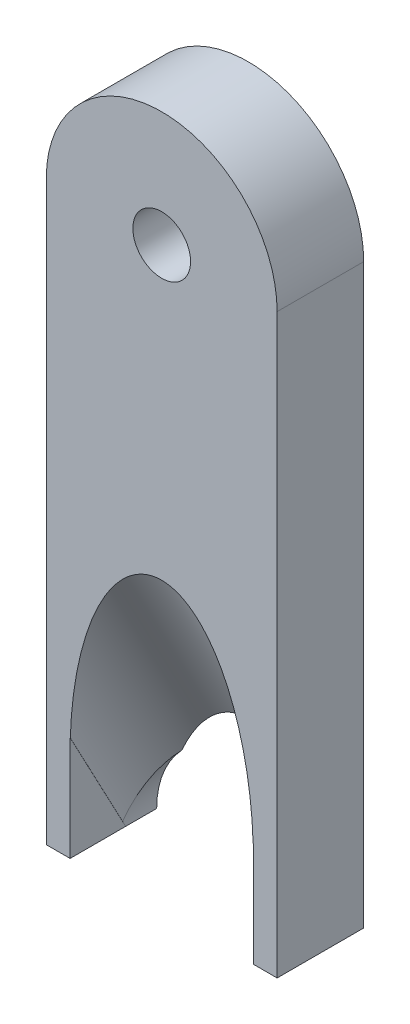
ISO-10303-21;
HEADER;
FILE_DESCRIPTION(('STEP AP214'),'2;1');
FILE_NAME('part.step','',(''),(''),'','','');
FILE_SCHEMA(('AUTOMOTIVE_DESIGN { 1 0 10303 214 1 1 1 1 }'));
ENDSEC;
DATA;
#1=APPLICATION_CONTEXT('core data for automotive mechanical design processes');
#2=APPLICATION_PROTOCOL_DEFINITION('international standard','automotive_design',2000,#1);
#3=PRODUCT_CONTEXT('',#1,'mechanical');
#4=PRODUCT('Part','Part','',(#3));
#5=PRODUCT_RELATED_PRODUCT_CATEGORY('part','',(#4));
#6=PRODUCT_DEFINITION_FORMATION('','',#4);
#7=PRODUCT_DEFINITION_CONTEXT('part definition',#1,'design');
#8=PRODUCT_DEFINITION('design','',#6,#7);
#9=PRODUCT_DEFINITION_SHAPE('','',#8);
#10=(LENGTH_UNIT() NAMED_UNIT(*) SI_UNIT(.MILLI.,.METRE.));
#11=(NAMED_UNIT(*) PLANE_ANGLE_UNIT() SI_UNIT($,.RADIAN.));
#12=(NAMED_UNIT(*) SI_UNIT($,.STERADIAN.) SOLID_ANGLE_UNIT());
#13=UNCERTAINTY_MEASURE_WITH_UNIT(LENGTH_MEASURE(1.E-05),#10,'distance_accuracy_value','');
#14=(GEOMETRIC_REPRESENTATION_CONTEXT(3) GLOBAL_UNCERTAINTY_ASSIGNED_CONTEXT((#13)) GLOBAL_UNIT_ASSIGNED_CONTEXT((#10,
#11,#12)) REPRESENTATION_CONTEXT('',''));
#15=CARTESIAN_POINT('',(0.,0.,0.));
#16=DIRECTION('',(0.,0.,1.));
#17=DIRECTION('',(1.,0.,0.));
#18=AXIS2_PLACEMENT_3D('',#15,#16,#17);
#19=CARTESIAN_POINT('',(0.,-100.,15.));
#20=DIRECTION('',(0.,0.,-1.));
#21=DIRECTION('',(-1.,0.,0.));
#22=AXIS2_PLACEMENT_3D('',#19,#20,#21);
#23=CYLINDRICAL_SURFACE('',#22,15.875);
#24=CARTESIAN_POINT('',(0.,-100.,5.37315456914315));
#25=DIRECTION('',(0.,-0.469471562785895,0.882947592858925));
#26=DIRECTION('',(0.,-0.882947592858925,-0.469471562785895));
#27=AXIS2_PLACEMENT_3D('',#24,#25,#26);
#28=ELLIPSE('',#27,17.9795495546885,15.875);
#29=CARTESIAN_POINT('',(15.8404269209739,-98.9528610592261,5.92992822021265));
#30=VERTEX_POINT('',#29);
#31=CARTESIAN_POINT('',(15.875,-100.,5.37315456914314));
#32=VERTEX_POINT('',#31);
#33=EDGE_CURVE('E211',#30,#32,#28,.F.);
#34=ORIENTED_EDGE('',*,*,#33,.F.);
#35=CARTESIAN_POINT('',(0.,-100.,6.55911277237393));
#36=DIRECTION('',(0.,-0.515038074910052,-0.857167300702113));
#37=DIRECTION('',(0.,0.857167300702113,-0.515038074910052));
#38=AXIS2_PLACEMENT_3D('',#35,#36,#37);
#39=ELLIPSE('',#38,18.5203051807933,15.875);
#40=CARTESIAN_POINT('',(11.5261560034812,-89.0838031905149,0.));
#41=VERTEX_POINT('',#40);
#42=EDGE_CURVE('E157',#41,#30,#39,.T.);
#43=ORIENTED_EDGE('',*,*,#42,.F.);
#44=CARTESIAN_POINT('',(0.,-100.,0.));
#45=DIRECTION('',(0.,0.,-1.));
#46=DIRECTION('',(-1.,0.,0.));
#47=AXIS2_PLACEMENT_3D('',#44,#45,#46);
#48=CIRCLE('',#47,15.875);
#49=CARTESIAN_POINT('',(15.875,-100.,0.));
#50=VERTEX_POINT('',#49);
#51=EDGE_CURVE('E188',#41,#50,#48,.T.);
#52=ORIENTED_EDGE('',*,*,#51,.T.);
#53=DIRECTION('',(0.,0.,-1.));
#54=VECTOR('',#53,1.);
#55=CARTESIAN_POINT('',(15.875,-100.,15.));
#56=LINE('',#55,#54);
#57=EDGE_CURVE('E198',#32,#50,#56,.T.);
#58=ORIENTED_EDGE('',*,*,#57,.F.);
#59=EDGE_LOOP('',(#34,#43,#52,#58));
#60=FACE_BOUND('',#59,.T.);
#61=ADVANCED_FACE('F33',(#60),#23,.F.);
#62=CARTESIAN_POINT('',(0.,-100.,5.37315456914315));
#63=DIRECTION('',(0.,-0.469471562785895,0.882947592858925));
#64=DIRECTION('',(0.,-0.882947592858925,-0.469471562785895));
#65=AXIS2_PLACEMENT_3D('',#62,#63,#64);
#66=ELLIPSE('',#65,17.9795495546885,15.875);
#67=CARTESIAN_POINT('',(-15.875,-100.,5.37315456914315));
#68=VERTEX_POINT('',#67);
#69=CARTESIAN_POINT('',(-15.8404269209739,-98.9528610592261,5.92992822021265));
#70=VERTEX_POINT('',#69);
#71=EDGE_CURVE('E48',#68,#70,#66,.F.);
#72=ORIENTED_EDGE('',*,*,#71,.F.);
#73=DIRECTION('',(0.,0.,-1.));
#74=VECTOR('',#73,1.);
#75=CARTESIAN_POINT('',(-15.875,-100.,15.));
#76=LINE('',#75,#74);
#77=CARTESIAN_POINT('',(-15.875,-100.,0.));
#78=VERTEX_POINT('',#77);
#79=EDGE_CURVE('E140',#68,#78,#76,.T.);
#80=ORIENTED_EDGE('',*,*,#79,.T.);
#81=CARTESIAN_POINT('',(-11.5261560034812,-89.0838031905148,0.));
#82=VERTEX_POINT('',#81);
#83=EDGE_CURVE('E189',#78,#82,#48,.T.);
#84=ORIENTED_EDGE('',*,*,#83,.T.);
#85=EDGE_CURVE('E165',#70,#82,#39,.T.);
#86=ORIENTED_EDGE('',*,*,#85,.F.);
#87=EDGE_LOOP('',(#72,#80,#84,#86));
#88=FACE_BOUND('',#87,.T.);
#89=ADVANCED_FACE('F236',(#88),#23,.F.);
#90=CARTESIAN_POINT('',(0.,0.,15.));
#91=DIRECTION('',(0.,0.,1.));
#92=DIRECTION('',(1.,0.,0.));
#93=AXIS2_PLACEMENT_3D('',#90,#91,#92);
#94=PLANE('',#93);
#95=CARTESIAN_POINT('',(0.,0.,15.));
#96=DIRECTION('',(0.,0.,1.));
#97=DIRECTION('',(1.,0.,0.));
#98=AXIS2_PLACEMENT_3D('',#95,#96,#97);
#99=CIRCLE('',#98,5.);
#100=CARTESIAN_POINT('',(5.,0.,15.));
#101=VERTEX_POINT('',#100);
#102=EDGE_CURVE('E168',#101,#101,#99,.T.);
#103=ORIENTED_EDGE('',*,*,#102,.F.);
#104=EDGE_LOOP('',(#103));
#105=FACE_BOUND('',#104,.T.);
#106=DIRECTION('',(0.,-1.,0.));
#107=VECTOR('',#106,1.);
#108=CARTESIAN_POINT('',(15.875,0.,15.));
#109=LINE('',#108,#107);
#110=CARTESIAN_POINT('',(15.875,-81.8945370203893,15.));
#111=VERTEX_POINT('',#110);
#112=CARTESIAN_POINT('',(15.875,-100.,15.));
#113=VERTEX_POINT('',#112);
#114=EDGE_CURVE('E216',#111,#113,#109,.T.);
#115=ORIENTED_EDGE('',*,*,#114,.T.);
#116=DIRECTION('',(1.,0.,0.));
#117=VECTOR('',#116,1.);
#118=CARTESIAN_POINT('',(20.,-100.,15.));
#119=LINE('',#118,#117);
#120=CARTESIAN_POINT('',(20.,-100.,15.));
#121=VERTEX_POINT('',#120);
#122=EDGE_CURVE('E135',#113,#121,#119,.T.);
#123=ORIENTED_EDGE('',*,*,#122,.T.);
#124=DIRECTION('',(0.,1.,0.));
#125=VECTOR('',#124,1.);
#126=CARTESIAN_POINT('',(20.,0.,15.));
#127=LINE('',#126,#125);
#128=CARTESIAN_POINT('',(20.,0.,15.));
#129=VERTEX_POINT('',#128);
#130=EDGE_CURVE('E179',#121,#129,#127,.T.);
#131=ORIENTED_EDGE('',*,*,#130,.T.);
#132=CARTESIAN_POINT('',(0.,0.,15.));
#133=DIRECTION('',(0.,0.,1.));
#134=DIRECTION('',(1.,0.,0.));
#135=AXIS2_PLACEMENT_3D('',#132,#133,#134);
#136=CIRCLE('',#135,20.);
#137=CARTESIAN_POINT('',(-20.,0.,15.));
#138=VERTEX_POINT('',#137);
#139=EDGE_CURVE('E174',#129,#138,#136,.T.);
#140=ORIENTED_EDGE('',*,*,#139,.T.);
#141=DIRECTION('',(0.,-1.,0.));
#142=VECTOR('',#141,1.);
#143=CARTESIAN_POINT('',(-20.,0.,15.));
#144=LINE('',#143,#142);
#145=CARTESIAN_POINT('',(-20.,-100.,15.));
#146=VERTEX_POINT('',#145);
#147=EDGE_CURVE('E131',#138,#146,#144,.T.);
#148=ORIENTED_EDGE('',*,*,#147,.T.);
#149=DIRECTION('',(1.,0.,0.));
#150=VECTOR('',#149,1.);
#151=CARTESIAN_POINT('',(-20.,-100.,15.));
#152=LINE('',#151,#150);
#153=CARTESIAN_POINT('',(-15.875,-100.,15.));
#154=VERTEX_POINT('',#153);
#155=EDGE_CURVE('E128',#146,#154,#152,.T.);
#156=ORIENTED_EDGE('',*,*,#155,.T.);
#157=DIRECTION('',(0.,1.,0.));
#158=VECTOR('',#157,1.);
#159=CARTESIAN_POINT('',(-15.875,0.,15.));
#160=LINE('',#159,#158);
#161=CARTESIAN_POINT('',(-15.875,-81.8945370203893,15.));
#162=VERTEX_POINT('',#161);
#163=EDGE_CURVE('E116',#154,#162,#160,.T.);
#164=ORIENTED_EDGE('',*,*,#163,.T.);
#165=DIRECTION('',(1.,0.,0.));
#166=VECTOR('',#165,1.);
#167=CARTESIAN_POINT('',(0.,-81.8945370203893,15.));
#168=LINE('',#167,#166);
#169=CARTESIAN_POINT('',(-15.8404269209739,-81.8945370203893,15.));
#170=VERTEX_POINT('',#169);
#171=EDGE_CURVE('E160',#162,#170,#168,.T.);
#172=ORIENTED_EDGE('',*,*,#171,.T.);
#173=CARTESIAN_POINT('',(0.,-84.125,15.));
#174=DIRECTION('',(0.,0.,1.));
#175=DIRECTION('',(0.,-1.,0.));
#176=AXIS2_PLACEMENT_3D('',#173,#174,#175);
#177=ELLIPSE('',#176,33.8146146825082,15.875);
#178=CARTESIAN_POINT('',(15.8404269209739,-81.8945370203893,15.));
#179=VERTEX_POINT('',#178);
#180=EDGE_CURVE('E155',#170,#179,#177,.F.);
#181=ORIENTED_EDGE('',*,*,#180,.T.);
#182=EDGE_CURVE('E55',#179,#111,#168,.T.);
#183=ORIENTED_EDGE('',*,*,#182,.T.);
#184=EDGE_LOOP('',(#115,#123,#131,#140,#148,#156,#164,#172,#181,#183));
#185=FACE_BOUND('',#184,.T.);
#186=ADVANCED_FACE('F129',(#105,#185),#94,.T.);
#187=CARTESIAN_POINT('',(0.,-46.2102295224906,35.1596410621721));
#188=DIRECTION('',(0.,-0.882947592858925,-0.469471562785895));
#189=DIRECTION('',(0.,0.469471562785895,-0.882947592858925));
#190=AXIS2_PLACEMENT_3D('',#187,#188,#189);
#191=CYLINDRICAL_SURFACE('',#190,15.875);
#192=ORIENTED_EDGE('',*,*,#180,.F.);
#193=DIRECTION('',(0.,-0.882947592858925,-0.469471562785895));
#194=VECTOR('',#193,1.);
#195=CARTESIAN_POINT('',(-15.8404269209739,-45.7186275675115,34.235072255027));
#196=LINE('',#195,#194);
#197=EDGE_CURVE('E11',#170,#70,#196,.T.);
#198=ORIENTED_EDGE('',*,*,#197,.T.);
#199=ORIENTED_EDGE('',*,*,#85,.T.);
#200=CARTESIAN_POINT('',(0.,-112.335896980195,0.));
#201=DIRECTION('',(0.,0.,1.));
#202=DIRECTION('',(0.,-1.,0.));
#203=AXIS2_PLACEMENT_3D('',#200,#201,#202);
#204=ELLIPSE('',#203,33.8146146825082,15.875);
#205=EDGE_CURVE('E161',#82,#41,#204,.F.);
#206=ORIENTED_EDGE('',*,*,#205,.T.);
#207=ORIENTED_EDGE('',*,*,#42,.T.);
#208=DIRECTION('',(0.,-0.882947592858925,-0.469471562785895));
#209=VECTOR('',#208,1.);
#210=CARTESIAN_POINT('',(15.8404269209739,-45.7186275675115,34.235072255027));
#211=LINE('',#210,#209);
#212=EDGE_CURVE('E41',#30,#179,#211,.F.);
#213=ORIENTED_EDGE('',*,*,#212,.T.);
#214=EDGE_LOOP('',(#192,#198,#199,#206,#207,#213));
#215=FACE_BOUND('',#214,.T.);
#216=ADVANCED_FACE('F154',(#215),#191,.F.);
#217=CARTESIAN_POINT('',(0.,0.,0.));
#218=DIRECTION('',(0.,0.,1.));
#219=DIRECTION('',(1.,0.,0.));
#220=AXIS2_PLACEMENT_3D('',#217,#218,#219);
#221=PLANE('',#220);
#222=ORIENTED_EDGE('',*,*,#205,.F.);
#223=ORIENTED_EDGE('',*,*,#83,.F.);
#224=DIRECTION('',(1.,0.,0.));
#225=VECTOR('',#224,1.);
#226=CARTESIAN_POINT('',(-20.,-100.,0.));
#227=LINE('',#226,#225);
#228=CARTESIAN_POINT('',(-20.,-100.,0.));
#229=VERTEX_POINT('',#228);
#230=EDGE_CURVE('E186',#229,#78,#227,.T.);
#231=ORIENTED_EDGE('',*,*,#230,.F.);
#232=DIRECTION('',(0.,-1.,0.));
#233=VECTOR('',#232,1.);
#234=CARTESIAN_POINT('',(-20.,0.,0.));
#235=LINE('',#234,#233);
#236=CARTESIAN_POINT('',(-20.,0.,0.));
#237=VERTEX_POINT('',#236);
#238=EDGE_CURVE('E184',#237,#229,#235,.T.);
#239=ORIENTED_EDGE('',*,*,#238,.F.);
#240=CARTESIAN_POINT('',(0.,0.,0.));
#241=DIRECTION('',(0.,0.,1.));
#242=DIRECTION('',(1.,0.,0.));
#243=AXIS2_PLACEMENT_3D('',#240,#241,#242);
#244=CIRCLE('',#243,20.);
#245=CARTESIAN_POINT('',(20.,0.,0.));
#246=VERTEX_POINT('',#245);
#247=EDGE_CURVE('E171',#246,#237,#244,.T.);
#248=ORIENTED_EDGE('',*,*,#247,.F.);
#249=DIRECTION('',(0.,1.,0.));
#250=VECTOR('',#249,1.);
#251=CARTESIAN_POINT('',(20.,0.,0.));
#252=LINE('',#251,#250);
#253=CARTESIAN_POINT('',(20.,-100.,0.));
#254=VERTEX_POINT('',#253);
#255=EDGE_CURVE('E176',#254,#246,#252,.T.);
#256=ORIENTED_EDGE('',*,*,#255,.F.);
#257=DIRECTION('',(1.,0.,0.));
#258=VECTOR('',#257,1.);
#259=CARTESIAN_POINT('',(20.,-100.,0.));
#260=LINE('',#259,#258);
#261=EDGE_CURVE('E192',#50,#254,#260,.T.);
#262=ORIENTED_EDGE('',*,*,#261,.F.);
#263=ORIENTED_EDGE('',*,*,#51,.F.);
#264=EDGE_LOOP('',(#222,#223,#231,#239,#248,#256,#262,#263));
#265=FACE_BOUND('',#264,.T.);
#266=CARTESIAN_POINT('',(0.,0.,0.));
#267=DIRECTION('',(0.,0.,1.));
#268=DIRECTION('',(1.,0.,0.));
#269=AXIS2_PLACEMENT_3D('',#266,#267,#268);
#270=CIRCLE('',#269,5.);
#271=CARTESIAN_POINT('',(5.,0.,0.));
#272=VERTEX_POINT('',#271);
#273=EDGE_CURVE('E163',#272,#272,#270,.T.);
#274=ORIENTED_EDGE('',*,*,#273,.T.);
#275=EDGE_LOOP('',(#274));
#276=FACE_BOUND('',#275,.T.);
#277=ADVANCED_FACE('F222',(#265,#276),#221,.F.);
#278=CARTESIAN_POINT('',(0.,0.,15.));
#279=DIRECTION('',(0.,0.,-1.));
#280=DIRECTION('',(-1.,0.,0.));
#281=AXIS2_PLACEMENT_3D('',#278,#279,#280);
#282=CYLINDRICAL_SURFACE('',#281,20.);
#283=ORIENTED_EDGE('',*,*,#247,.T.);
#284=DIRECTION('',(0.,0.,-1.));
#285=VECTOR('',#284,1.);
#286=CARTESIAN_POINT('',(-20.,0.,15.));
#287=LINE('',#286,#285);
#288=EDGE_CURVE('E143',#138,#237,#287,.T.);
#289=ORIENTED_EDGE('',*,*,#288,.F.);
#290=ORIENTED_EDGE('',*,*,#139,.F.);
#291=DIRECTION('',(0.,0.,-1.));
#292=VECTOR('',#291,1.);
#293=CARTESIAN_POINT('',(20.,0.,15.));
#294=LINE('',#293,#292);
#295=EDGE_CURVE('E181',#129,#246,#294,.T.);
#296=ORIENTED_EDGE('',*,*,#295,.T.);
#297=EDGE_LOOP('',(#283,#289,#290,#296));
#298=FACE_BOUND('',#297,.T.);
#299=ADVANCED_FACE('F35',(#298),#282,.T.);
#300=CARTESIAN_POINT('',(-20.,0.,15.));
#301=DIRECTION('',(1.,0.,0.));
#302=DIRECTION('',(0.,1.,0.));
#303=AXIS2_PLACEMENT_3D('',#300,#301,#302);
#304=PLANE('',#303);
#305=ORIENTED_EDGE('',*,*,#238,.T.);
#306=DIRECTION('',(0.,0.,-1.));
#307=VECTOR('',#306,1.);
#308=CARTESIAN_POINT('',(-20.,-100.,15.));
#309=LINE('',#308,#307);
#310=EDGE_CURVE('E141',#146,#229,#309,.T.);
#311=ORIENTED_EDGE('',*,*,#310,.F.);
#312=ORIENTED_EDGE('',*,*,#147,.F.);
#313=ORIENTED_EDGE('',*,*,#288,.T.);
#314=EDGE_LOOP('',(#305,#311,#312,#313));
#315=FACE_BOUND('',#314,.T.);
#316=ADVANCED_FACE('F240',(#315),#304,.F.);
#317=CARTESIAN_POINT('',(-20.,-100.,15.));
#318=DIRECTION('',(0.,1.,0.));
#319=DIRECTION('',(0.,0.,1.));
#320=AXIS2_PLACEMENT_3D('',#317,#318,#319);
#321=PLANE('',#320);
#322=ORIENTED_EDGE('',*,*,#230,.T.);
#323=ORIENTED_EDGE('',*,*,#79,.F.);
#324=EDGE_CURVE('E120',#154,#68,#76,.T.);
#325=ORIENTED_EDGE('',*,*,#324,.F.);
#326=ORIENTED_EDGE('',*,*,#155,.F.);
#327=ORIENTED_EDGE('',*,*,#310,.T.);
#328=EDGE_LOOP('',(#322,#323,#325,#326,#327));
#329=FACE_BOUND('',#328,.T.);
#330=ADVANCED_FACE('F139',(#329),#321,.F.);
#331=CARTESIAN_POINT('',(20.,-100.,15.));
#332=DIRECTION('',(0.,1.,0.));
#333=DIRECTION('',(0.,0.,1.));
#334=AXIS2_PLACEMENT_3D('',#331,#332,#333);
#335=PLANE('',#334);
#336=ORIENTED_EDGE('',*,*,#261,.T.);
#337=DIRECTION('',(0.,0.,-1.));
#338=VECTOR('',#337,1.);
#339=CARTESIAN_POINT('',(20.,-100.,15.));
#340=LINE('',#339,#338);
#341=EDGE_CURVE('E196',#121,#254,#340,.T.);
#342=ORIENTED_EDGE('',*,*,#341,.F.);
#343=ORIENTED_EDGE('',*,*,#122,.F.);
#344=EDGE_CURVE('E145',#113,#32,#56,.T.);
#345=ORIENTED_EDGE('',*,*,#344,.T.);
#346=ORIENTED_EDGE('',*,*,#57,.T.);
#347=EDGE_LOOP('',(#336,#342,#343,#345,#346));
#348=FACE_BOUND('',#347,.T.);
#349=ADVANCED_FACE('F208',(#348),#335,.F.);
#350=CARTESIAN_POINT('',(20.,0.,15.));
#351=DIRECTION('',(-1.,0.,0.));
#352=DIRECTION('',(0.,-1.,0.));
#353=AXIS2_PLACEMENT_3D('',#350,#351,#352);
#354=PLANE('',#353);
#355=ORIENTED_EDGE('',*,*,#255,.T.);
#356=ORIENTED_EDGE('',*,*,#295,.F.);
#357=ORIENTED_EDGE('',*,*,#130,.F.);
#358=ORIENTED_EDGE('',*,*,#341,.T.);
#359=EDGE_LOOP('',(#355,#356,#357,#358));
#360=FACE_BOUND('',#359,.T.);
#361=ADVANCED_FACE('F226',(#360),#354,.F.);
#362=CARTESIAN_POINT('',(0.,0.,15.));
#363=DIRECTION('',(0.,0.,-1.));
#364=DIRECTION('',(-1.,0.,0.));
#365=AXIS2_PLACEMENT_3D('',#362,#363,#364);
#366=CYLINDRICAL_SURFACE('',#365,5.);
#367=ORIENTED_EDGE('',*,*,#102,.T.);
#368=EDGE_LOOP('',(#367));
#369=FACE_BOUND('',#368,.T.);
#370=ORIENTED_EDGE('',*,*,#273,.F.);
#371=EDGE_LOOP('',(#370));
#372=FACE_BOUND('',#371,.T.);
#373=ADVANCED_FACE('F263',(#369,#372),#366,.F.);
#374=CARTESIAN_POINT('',(15.875,-48.3674703460883,32.8266575666693));
#375=DIRECTION('',(0.,-0.469471562785895,0.882947592858925));
#376=DIRECTION('',(0.,-0.882947592858925,-0.469471562785895));
#377=AXIS2_PLACEMENT_3D('',#374,#375,#376);
#378=PLANE('',#377);
#379=ORIENTED_EDGE('',*,*,#33,.T.);
#380=DIRECTION('',(0.,-0.882947592858925,-0.469471562785895));
#381=VECTOR('',#380,1.);
#382=CARTESIAN_POINT('',(15.875,-48.3674703460883,32.8266575666693));
#383=LINE('',#382,#381);
#384=EDGE_CURVE('E125',#111,#32,#383,.T.);
#385=ORIENTED_EDGE('',*,*,#384,.F.);
#386=ORIENTED_EDGE('',*,*,#182,.F.);
#387=ORIENTED_EDGE('',*,*,#212,.F.);
#388=EDGE_LOOP('',(#379,#385,#386,#387));
#389=FACE_BOUND('',#388,.T.);
#390=ADVANCED_FACE('F212',(#389),#378,.T.);
#391=CARTESIAN_POINT('',(15.875,-52.3579786297684,40.3317121059701));
#392=DIRECTION('',(-1.,0.,0.));
#393=DIRECTION('',(0.,0.,1.));
#394=AXIS2_PLACEMENT_3D('',#391,#392,#393);
#395=PLANE('',#394);
#396=ORIENTED_EDGE('',*,*,#384,.T.);
#397=ORIENTED_EDGE('',*,*,#344,.F.);
#398=ORIENTED_EDGE('',*,*,#114,.F.);
#399=EDGE_LOOP('',(#396,#397,#398));
#400=FACE_BOUND('',#399,.T.);
#401=ADVANCED_FACE('F215',(#400),#395,.T.);
#402=ORIENTED_EDGE('',*,*,#71,.T.);
#403=ORIENTED_EDGE('',*,*,#197,.F.);
#404=ORIENTED_EDGE('',*,*,#171,.F.);
#405=DIRECTION('',(0.,-0.882947592858925,-0.469471562785895));
#406=VECTOR('',#405,1.);
#407=CARTESIAN_POINT('',(-15.875,-48.3674703460883,32.8266575666693));
#408=LINE('',#407,#406);
#409=EDGE_CURVE('E121',#162,#68,#408,.T.);
#410=ORIENTED_EDGE('',*,*,#409,.T.);
#411=EDGE_LOOP('',(#402,#403,#404,#410));
#412=FACE_BOUND('',#411,.T.);
#413=ADVANCED_FACE('F233',(#412),#378,.T.);
#414=CARTESIAN_POINT('',(-15.875,-52.3579786297684,40.3317121059702));
#415=DIRECTION('',(1.,0.,0.));
#416=DIRECTION('',(0.,0.,-1.));
#417=AXIS2_PLACEMENT_3D('',#414,#415,#416);
#418=PLANE('',#417);
#419=ORIENTED_EDGE('',*,*,#324,.T.);
#420=ORIENTED_EDGE('',*,*,#409,.F.);
#421=ORIENTED_EDGE('',*,*,#163,.F.);
#422=EDGE_LOOP('',(#419,#420,#421));
#423=FACE_BOUND('',#422,.T.);
#424=ADVANCED_FACE('F118',(#423),#418,.T.);
#425=CLOSED_SHELL('',(#61,#89,#186,#216,#277,#299,#316,#330,#349,#361,#373,#390,#401,#413,#424));
#426=MANIFOLD_SOLID_BREP('B2',#425);
#427=ADVANCED_BREP_SHAPE_REPRESENTATION('',(#18,#426),#14);
#428=SHAPE_DEFINITION_REPRESENTATION(#9,#427);
ENDSEC;
END-ISO-10303-21;
